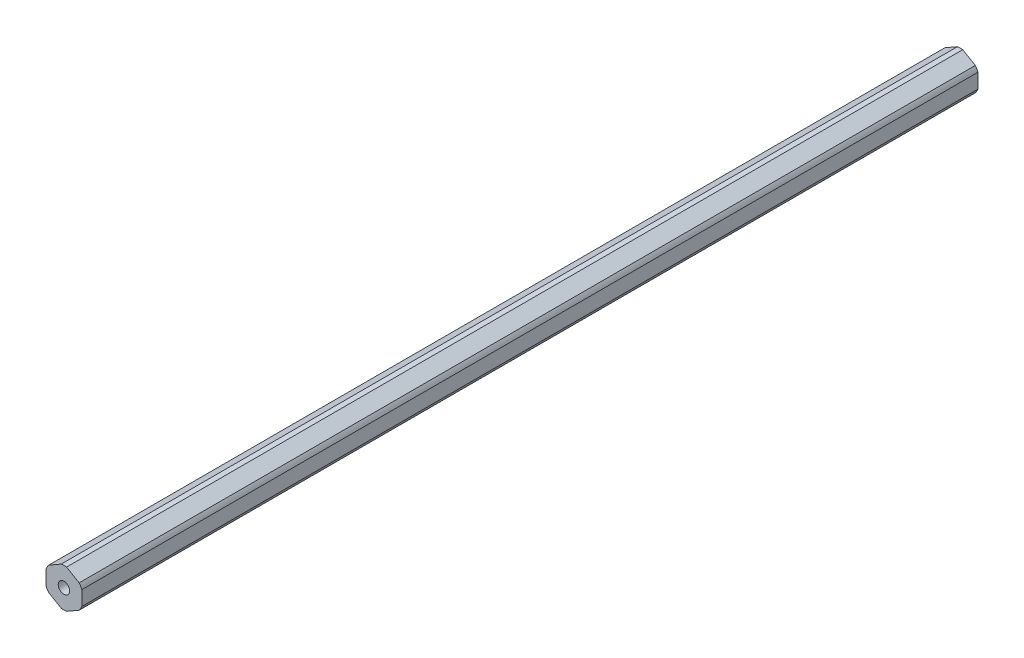
ISO-10303-21;
HEADER;
FILE_DESCRIPTION(('STEP AP214'),'2;1');
FILE_NAME('part.step','',(''),(''),'','','');
FILE_SCHEMA(('AUTOMOTIVE_DESIGN { 1 0 10303 214 1 1 1 1 }'));
ENDSEC;
DATA;
#1=APPLICATION_CONTEXT('core data for automotive mechanical design processes');
#2=APPLICATION_PROTOCOL_DEFINITION('international standard','automotive_design',2000,#1);
#3=PRODUCT_CONTEXT('',#1,'mechanical');
#4=PRODUCT('Part','Part','',(#3));
#5=PRODUCT_RELATED_PRODUCT_CATEGORY('part','',(#4));
#6=PRODUCT_DEFINITION_FORMATION('','',#4);
#7=PRODUCT_DEFINITION_CONTEXT('part definition',#1,'design');
#8=PRODUCT_DEFINITION('design','',#6,#7);
#9=PRODUCT_DEFINITION_SHAPE('','',#8);
#10=(LENGTH_UNIT() NAMED_UNIT(*) SI_UNIT(.MILLI.,.METRE.));
#11=(NAMED_UNIT(*) PLANE_ANGLE_UNIT() SI_UNIT($,.RADIAN.));
#12=(NAMED_UNIT(*) SI_UNIT($,.STERADIAN.) SOLID_ANGLE_UNIT());
#13=UNCERTAINTY_MEASURE_WITH_UNIT(LENGTH_MEASURE(1.E-05),#10,'distance_accuracy_value','');
#14=(GEOMETRIC_REPRESENTATION_CONTEXT(3) GLOBAL_UNCERTAINTY_ASSIGNED_CONTEXT((#13)) GLOBAL_UNIT_ASSIGNED_CONTEXT((#10,
#11,#12)) REPRESENTATION_CONTEXT('',''));
#15=CARTESIAN_POINT('',(0.,0.,0.));
#16=DIRECTION('',(0.,0.,1.));
#17=DIRECTION('',(1.,0.,0.));
#18=AXIS2_PLACEMENT_3D('',#15,#16,#17);
#19=CARTESIAN_POINT('',(6.35,0.,158.8516));
#20=DIRECTION('',(-1.,0.,0.));
#21=DIRECTION('',(0.,0.,1.));
#22=AXIS2_PLACEMENT_3D('',#19,#20,#21);
#23=PLANE('',#22);
#24=DIRECTION('',(0.,1.,0.));
#25=VECTOR('',#24,1.);
#26=CARTESIAN_POINT('',(6.35,0.,-158.8516));
#27=LINE('',#26,#25);
#28=CARTESIAN_POINT('',(6.35,-2.59030191290513,-158.8516));
#29=VERTEX_POINT('',#28);
#30=CARTESIAN_POINT('',(6.35,2.59030191290513,-158.8516));
#31=VERTEX_POINT('',#30);
#32=EDGE_CURVE('E187',#29,#31,#27,.T.);
#33=ORIENTED_EDGE('',*,*,#32,.T.);
#34=DIRECTION('',(0.,0.,-1.));
#35=VECTOR('',#34,1.);
#36=CARTESIAN_POINT('',(6.35,2.59030191290513,158.8516));
#37=LINE('',#36,#35);
#38=CARTESIAN_POINT('',(6.35,2.59030191290513,158.8516));
#39=VERTEX_POINT('',#38);
#40=EDGE_CURVE('E11',#39,#31,#37,.T.);
#41=ORIENTED_EDGE('',*,*,#40,.F.);
#42=DIRECTION('',(0.,1.,0.));
#43=VECTOR('',#42,1.);
#44=CARTESIAN_POINT('',(6.35,0.,158.8516));
#45=LINE('',#44,#43);
#46=CARTESIAN_POINT('',(6.35,-2.59030191290513,158.8516));
#47=VERTEX_POINT('',#46);
#48=EDGE_CURVE('E267',#47,#39,#45,.T.);
#49=ORIENTED_EDGE('',*,*,#48,.F.);
#50=DIRECTION('',(0.,0.,-1.));
#51=VECTOR('',#50,1.);
#52=CARTESIAN_POINT('',(6.35,-2.59030191290513,158.8516));
#53=LINE('',#52,#51);
#54=EDGE_CURVE('E183',#47,#29,#53,.T.);
#55=ORIENTED_EDGE('',*,*,#54,.T.);
#56=EDGE_LOOP('',(#33,#41,#49,#55));
#57=FACE_BOUND('',#56,.T.);
#58=ADVANCED_FACE('F58',(#57),#23,.F.);
#59=CARTESIAN_POINT('',(0.,0.,158.8516));
#60=DIRECTION('',(0.,0.,-1.));
#61=DIRECTION('',(-1.,0.,0.));
#62=AXIS2_PLACEMENT_3D('',#59,#60,#61);
#63=CYLINDRICAL_SURFACE('',#62,6.858);
#64=CARTESIAN_POINT('',(0.,0.,-158.8516));
#65=DIRECTION('',(0.,0.,1.));
#66=DIRECTION('',(1.,0.,0.));
#67=AXIS2_PLACEMENT_3D('',#64,#65,#66);
#68=CIRCLE('',#67,6.858);
#69=CARTESIAN_POINT('',(5.41826726004727,4.20411035757862,-158.8516));
#70=VERTEX_POINT('',#69);
#71=EDGE_CURVE('E191',#31,#70,#68,.T.);
#72=ORIENTED_EDGE('',*,*,#71,.T.);
#73=DIRECTION('',(0.,0.,-1.));
#74=VECTOR('',#73,1.);
#75=CARTESIAN_POINT('',(5.41826726004727,4.20411035757862,158.8516));
#76=LINE('',#75,#74);
#77=CARTESIAN_POINT('',(5.41826726004727,4.20411035757862,158.8516));
#78=VERTEX_POINT('',#77);
#79=EDGE_CURVE('E67',#78,#70,#76,.T.);
#80=ORIENTED_EDGE('',*,*,#79,.F.);
#81=CARTESIAN_POINT('',(0.,0.,158.8516));
#82=DIRECTION('',(0.,0.,1.));
#83=DIRECTION('',(1.,0.,0.));
#84=AXIS2_PLACEMENT_3D('',#81,#82,#83);
#85=CIRCLE('',#84,6.858);
#86=EDGE_CURVE('E131',#39,#78,#85,.T.);
#87=ORIENTED_EDGE('',*,*,#86,.F.);
#88=ORIENTED_EDGE('',*,*,#40,.T.);
#89=EDGE_LOOP('',(#72,#80,#87,#88));
#90=FACE_BOUND('',#89,.T.);
#91=ADVANCED_FACE('F310',(#90),#63,.T.);
#92=CARTESIAN_POINT('',(3.175,5.49926131403119,158.8516));
#93=DIRECTION('',(-0.5,-0.866025403784439,0.));
#94=DIRECTION('',(0.866025403784439,-0.5,0.));
#95=AXIS2_PLACEMENT_3D('',#92,#93,#94);
#96=PLANE('',#95);
#97=DIRECTION('',(-0.866025403784439,0.5,0.));
#98=VECTOR('',#97,1.);
#99=CARTESIAN_POINT('',(3.175,5.49926131403119,-158.8516));
#100=LINE('',#99,#98);
#101=CARTESIAN_POINT('',(0.931732739952729,6.79441227048375,-158.8516));
#102=VERTEX_POINT('',#101);
#103=EDGE_CURVE('E195',#70,#102,#100,.T.);
#104=ORIENTED_EDGE('',*,*,#103,.T.);
#105=DIRECTION('',(0.,0.,-1.));
#106=VECTOR('',#105,1.);
#107=CARTESIAN_POINT('',(0.931732739952729,6.79441227048375,158.8516));
#108=LINE('',#107,#106);
#109=CARTESIAN_POINT('',(0.931732739952729,6.79441227048375,158.8516));
#110=VERTEX_POINT('',#109);
#111=EDGE_CURVE('E238',#110,#102,#108,.T.);
#112=ORIENTED_EDGE('',*,*,#111,.F.);
#113=DIRECTION('',(-0.866025403784439,0.5,0.));
#114=VECTOR('',#113,1.);
#115=CARTESIAN_POINT('',(3.175,5.49926131403119,158.8516));
#116=LINE('',#115,#114);
#117=EDGE_CURVE('E248',#78,#110,#116,.T.);
#118=ORIENTED_EDGE('',*,*,#117,.F.);
#119=ORIENTED_EDGE('',*,*,#79,.T.);
#120=EDGE_LOOP('',(#104,#112,#118,#119));
#121=FACE_BOUND('',#120,.T.);
#122=ADVANCED_FACE('F246',(#121),#96,.F.);
#123=CARTESIAN_POINT('',(-0.931732739952725,6.79441227048375,-158.8516));
#124=VERTEX_POINT('',#123);
#125=EDGE_CURVE('E196',#102,#124,#68,.T.);
#126=ORIENTED_EDGE('',*,*,#125,.T.);
#127=DIRECTION('',(0.,0.,-1.));
#128=VECTOR('',#127,1.);
#129=CARTESIAN_POINT('',(-0.931732739952725,6.79441227048375,158.8516));
#130=LINE('',#129,#128);
#131=CARTESIAN_POINT('',(-0.931732739952725,6.79441227048375,158.8516));
#132=VERTEX_POINT('',#131);
#133=EDGE_CURVE('E234',#132,#124,#130,.T.);
#134=ORIENTED_EDGE('',*,*,#133,.F.);
#135=EDGE_CURVE('E273',#110,#132,#85,.T.);
#136=ORIENTED_EDGE('',*,*,#135,.F.);
#137=ORIENTED_EDGE('',*,*,#111,.T.);
#138=EDGE_LOOP('',(#126,#134,#136,#137));
#139=FACE_BOUND('',#138,.T.);
#140=ADVANCED_FACE('F293',(#139),#63,.T.);
#141=CARTESIAN_POINT('',(-3.175,5.49926131403118,158.8516));
#142=DIRECTION('',(0.5,-0.866025403784439,0.));
#143=DIRECTION('',(0.866025403784439,0.5,0.));
#144=AXIS2_PLACEMENT_3D('',#141,#142,#143);
#145=PLANE('',#144);
#146=DIRECTION('',(-0.866025403784439,-0.5,0.));
#147=VECTOR('',#146,1.);
#148=CARTESIAN_POINT('',(-3.175,5.49926131403118,-158.8516));
#149=LINE('',#148,#147);
#150=CARTESIAN_POINT('',(-5.41826726004727,4.20411035757862,-158.8516));
#151=VERTEX_POINT('',#150);
#152=EDGE_CURVE('E199',#124,#151,#149,.T.);
#153=ORIENTED_EDGE('',*,*,#152,.T.);
#154=DIRECTION('',(0.,0.,-1.));
#155=VECTOR('',#154,1.);
#156=CARTESIAN_POINT('',(-5.41826726004727,4.20411035757862,158.8516));
#157=LINE('',#156,#155);
#158=CARTESIAN_POINT('',(-5.41826726004727,4.20411035757862,158.8516));
#159=VERTEX_POINT('',#158);
#160=EDGE_CURVE('E230',#159,#151,#157,.T.);
#161=ORIENTED_EDGE('',*,*,#160,.F.);
#162=DIRECTION('',(-0.866025403784439,-0.5,0.));
#163=VECTOR('',#162,1.);
#164=CARTESIAN_POINT('',(-3.175,5.49926131403118,158.8516));
#165=LINE('',#164,#163);
#166=EDGE_CURVE('E279',#132,#159,#165,.T.);
#167=ORIENTED_EDGE('',*,*,#166,.F.);
#168=ORIENTED_EDGE('',*,*,#133,.T.);
#169=EDGE_LOOP('',(#153,#161,#167,#168));
#170=FACE_BOUND('',#169,.T.);
#171=ADVANCED_FACE('F295',(#170),#145,.F.);
#172=CARTESIAN_POINT('',(-6.35,2.59030191290514,-158.8516));
#173=VERTEX_POINT('',#172);
#174=EDGE_CURVE('E202',#151,#173,#68,.T.);
#175=ORIENTED_EDGE('',*,*,#174,.T.);
#176=DIRECTION('',(0.,0.,-1.));
#177=VECTOR('',#176,1.);
#178=CARTESIAN_POINT('',(-6.35,2.59030191290514,158.8516));
#179=LINE('',#178,#177);
#180=CARTESIAN_POINT('',(-6.35,2.59030191290514,158.8516));
#181=VERTEX_POINT('',#180);
#182=EDGE_CURVE('E226',#181,#173,#179,.T.);
#183=ORIENTED_EDGE('',*,*,#182,.F.);
#184=EDGE_CURVE('E281',#159,#181,#85,.T.);
#185=ORIENTED_EDGE('',*,*,#184,.F.);
#186=ORIENTED_EDGE('',*,*,#160,.T.);
#187=EDGE_LOOP('',(#175,#183,#185,#186));
#188=FACE_BOUND('',#187,.T.);
#189=ADVANCED_FACE('F296',(#188),#63,.T.);
#190=CARTESIAN_POINT('',(-6.35,0.,158.8516));
#191=DIRECTION('',(1.,0.,0.));
#192=DIRECTION('',(0.,0.,-1.));
#193=AXIS2_PLACEMENT_3D('',#190,#191,#192);
#194=PLANE('',#193);
#195=DIRECTION('',(0.,-1.,0.));
#196=VECTOR('',#195,1.);
#197=CARTESIAN_POINT('',(-6.35,0.,-158.8516));
#198=LINE('',#197,#196);
#199=CARTESIAN_POINT('',(-6.35,-2.59030191290514,-158.8516));
#200=VERTEX_POINT('',#199);
#201=EDGE_CURVE('E203',#173,#200,#198,.T.);
#202=ORIENTED_EDGE('',*,*,#201,.T.);
#203=DIRECTION('',(0.,0.,-1.));
#204=VECTOR('',#203,1.);
#205=CARTESIAN_POINT('',(-6.35,-2.59030191290514,158.8516));
#206=LINE('',#205,#204);
#207=CARTESIAN_POINT('',(-6.35,-2.59030191290514,158.8516));
#208=VERTEX_POINT('',#207);
#209=EDGE_CURVE('E222',#208,#200,#206,.T.);
#210=ORIENTED_EDGE('',*,*,#209,.F.);
#211=DIRECTION('',(0.,-1.,0.));
#212=VECTOR('',#211,1.);
#213=CARTESIAN_POINT('',(-6.35,0.,158.8516));
#214=LINE('',#213,#212);
#215=EDGE_CURVE('E282',#181,#208,#214,.T.);
#216=ORIENTED_EDGE('',*,*,#215,.F.);
#217=ORIENTED_EDGE('',*,*,#182,.T.);
#218=EDGE_LOOP('',(#202,#210,#216,#217));
#219=FACE_BOUND('',#218,.T.);
#220=ADVANCED_FACE('F299',(#219),#194,.F.);
#221=CARTESIAN_POINT('',(-5.41826726004728,-4.20411035757862,-158.8516));
#222=VERTEX_POINT('',#221);
#223=EDGE_CURVE('E206',#200,#222,#68,.T.);
#224=ORIENTED_EDGE('',*,*,#223,.T.);
#225=DIRECTION('',(0.,0.,-1.));
#226=VECTOR('',#225,1.);
#227=CARTESIAN_POINT('',(-5.41826726004728,-4.20411035757862,158.8516));
#228=LINE('',#227,#226);
#229=CARTESIAN_POINT('',(-5.41826726004728,-4.20411035757862,158.8516));
#230=VERTEX_POINT('',#229);
#231=EDGE_CURVE('E218',#230,#222,#228,.T.);
#232=ORIENTED_EDGE('',*,*,#231,.F.);
#233=EDGE_CURVE('E170',#208,#230,#85,.T.);
#234=ORIENTED_EDGE('',*,*,#233,.F.);
#235=ORIENTED_EDGE('',*,*,#209,.T.);
#236=EDGE_LOOP('',(#224,#232,#234,#235));
#237=FACE_BOUND('',#236,.T.);
#238=ADVANCED_FACE('F301',(#237),#63,.T.);
#239=CARTESIAN_POINT('',(-3.175,-5.49926131403118,158.8516));
#240=DIRECTION('',(0.5,0.866025403784439,0.));
#241=DIRECTION('',(-0.866025403784439,0.5,0.));
#242=AXIS2_PLACEMENT_3D('',#239,#240,#241);
#243=PLANE('',#242);
#244=DIRECTION('',(0.866025403784439,-0.5,0.));
#245=VECTOR('',#244,1.);
#246=CARTESIAN_POINT('',(-3.175,-5.49926131403118,-158.8516));
#247=LINE('',#246,#245);
#248=CARTESIAN_POINT('',(-0.931732739952722,-6.79441227048375,-158.8516));
#249=VERTEX_POINT('',#248);
#250=EDGE_CURVE('E207',#222,#249,#247,.T.);
#251=ORIENTED_EDGE('',*,*,#250,.T.);
#252=DIRECTION('',(0.,0.,-1.));
#253=VECTOR('',#252,1.);
#254=CARTESIAN_POINT('',(-0.931732739952722,-6.79441227048375,158.8516));
#255=LINE('',#254,#253);
#256=CARTESIAN_POINT('',(-0.931732739952722,-6.79441227048375,158.8516));
#257=VERTEX_POINT('',#256);
#258=EDGE_CURVE('E176',#257,#249,#255,.T.);
#259=ORIENTED_EDGE('',*,*,#258,.F.);
#260=DIRECTION('',(0.866025403784439,-0.5,0.));
#261=VECTOR('',#260,1.);
#262=CARTESIAN_POINT('',(-3.175,-5.49926131403118,158.8516));
#263=LINE('',#262,#261);
#264=EDGE_CURVE('E164',#230,#257,#263,.T.);
#265=ORIENTED_EDGE('',*,*,#264,.F.);
#266=ORIENTED_EDGE('',*,*,#231,.T.);
#267=EDGE_LOOP('',(#251,#259,#265,#266));
#268=FACE_BOUND('',#267,.T.);
#269=ADVANCED_FACE('F304',(#268),#243,.F.);
#270=CARTESIAN_POINT('',(0.93173273995273,-6.79441227048375,-158.8516));
#271=VERTEX_POINT('',#270);
#272=EDGE_CURVE('E174',#249,#271,#68,.T.);
#273=ORIENTED_EDGE('',*,*,#272,.T.);
#274=DIRECTION('',(0.,0.,-1.));
#275=VECTOR('',#274,1.);
#276=CARTESIAN_POINT('',(0.93173273995273,-6.79441227048375,158.8516));
#277=LINE('',#276,#275);
#278=CARTESIAN_POINT('',(0.93173273995273,-6.79441227048375,158.8516));
#279=VERTEX_POINT('',#278);
#280=EDGE_CURVE('E171',#279,#271,#277,.T.);
#281=ORIENTED_EDGE('',*,*,#280,.F.);
#282=EDGE_CURVE('E158',#257,#279,#85,.T.);
#283=ORIENTED_EDGE('',*,*,#282,.F.);
#284=ORIENTED_EDGE('',*,*,#258,.T.);
#285=EDGE_LOOP('',(#273,#281,#283,#284));
#286=FACE_BOUND('',#285,.T.);
#287=ADVANCED_FACE('F172',(#286),#63,.T.);
#288=CARTESIAN_POINT('',(3.175,-5.49926131403119,158.8516));
#289=DIRECTION('',(-0.5,0.866025403784439,0.));
#290=DIRECTION('',(-0.866025403784439,-0.5,0.));
#291=AXIS2_PLACEMENT_3D('',#288,#289,#290);
#292=PLANE('',#291);
#293=DIRECTION('',(0.866025403784439,0.5,0.));
#294=VECTOR('',#293,1.);
#295=CARTESIAN_POINT('',(3.175,-5.49926131403119,-158.8516));
#296=LINE('',#295,#294);
#297=CARTESIAN_POINT('',(5.41826726004727,-4.20411035757862,-158.8516));
#298=VERTEX_POINT('',#297);
#299=EDGE_CURVE('E117',#271,#298,#296,.T.);
#300=ORIENTED_EDGE('',*,*,#299,.T.);
#301=DIRECTION('',(0.,0.,-1.));
#302=VECTOR('',#301,1.);
#303=CARTESIAN_POINT('',(5.41826726004727,-4.20411035757862,158.8516));
#304=LINE('',#303,#302);
#305=CARTESIAN_POINT('',(5.41826726004727,-4.20411035757862,158.8516));
#306=VERTEX_POINT('',#305);
#307=EDGE_CURVE('E177',#306,#298,#304,.T.);
#308=ORIENTED_EDGE('',*,*,#307,.F.);
#309=DIRECTION('',(0.866025403784439,0.5,0.));
#310=VECTOR('',#309,1.);
#311=CARTESIAN_POINT('',(3.175,-5.49926131403119,158.8516));
#312=LINE('',#311,#310);
#313=EDGE_CURVE('E162',#279,#306,#312,.T.);
#314=ORIENTED_EDGE('',*,*,#313,.F.);
#315=ORIENTED_EDGE('',*,*,#280,.T.);
#316=EDGE_LOOP('',(#300,#308,#314,#315));
#317=FACE_BOUND('',#316,.T.);
#318=ADVANCED_FACE('F179',(#317),#292,.F.);
#319=EDGE_CURVE('E123',#298,#29,#68,.T.);
#320=ORIENTED_EDGE('',*,*,#319,.T.);
#321=ORIENTED_EDGE('',*,*,#54,.F.);
#322=EDGE_CURVE('E75',#306,#47,#85,.T.);
#323=ORIENTED_EDGE('',*,*,#322,.F.);
#324=ORIENTED_EDGE('',*,*,#307,.T.);
#325=EDGE_LOOP('',(#320,#321,#323,#324));
#326=FACE_BOUND('',#325,.T.);
#327=ADVANCED_FACE('F307',(#326),#63,.T.);
#328=CARTESIAN_POINT('',(0.,0.,158.8516));
#329=DIRECTION('',(0.,0.,1.));
#330=DIRECTION('',(1.,0.,0.));
#331=AXIS2_PLACEMENT_3D('',#328,#329,#330);
#332=PLANE('',#331);
#333=CARTESIAN_POINT('',(0.,0.,158.8516));
#334=DIRECTION('',(0.,0.,1.));
#335=DIRECTION('',(1.,0.,0.));
#336=AXIS2_PLACEMENT_3D('',#333,#334,#335);
#337=CIRCLE('',#336,2.01929999999999);
#338=CARTESIAN_POINT('',(2.01929999999999,0.,158.8516));
#339=VERTEX_POINT('',#338);
#340=EDGE_CURVE('E480',#339,#339,#337,.T.);
#341=ORIENTED_EDGE('',*,*,#340,.F.);
#342=EDGE_LOOP('',(#341));
#343=FACE_BOUND('',#342,.T.);
#344=ORIENTED_EDGE('',*,*,#48,.T.);
#345=ORIENTED_EDGE('',*,*,#86,.T.);
#346=ORIENTED_EDGE('',*,*,#117,.T.);
#347=ORIENTED_EDGE('',*,*,#135,.T.);
#348=ORIENTED_EDGE('',*,*,#166,.T.);
#349=ORIENTED_EDGE('',*,*,#184,.T.);
#350=ORIENTED_EDGE('',*,*,#215,.T.);
#351=ORIENTED_EDGE('',*,*,#233,.T.);
#352=ORIENTED_EDGE('',*,*,#264,.T.);
#353=ORIENTED_EDGE('',*,*,#282,.T.);
#354=ORIENTED_EDGE('',*,*,#313,.T.);
#355=ORIENTED_EDGE('',*,*,#322,.T.);
#356=EDGE_LOOP('',(#344,#345,#346,#347,#348,#349,#350,#351,#352,#353,#354,#355));
#357=FACE_BOUND('',#356,.T.);
#358=ADVANCED_FACE('F160',(#343,#357),#332,.T.);
#359=CARTESIAN_POINT('',(0.,0.,-158.8516));
#360=DIRECTION('',(0.,0.,1.));
#361=DIRECTION('',(1.,0.,0.));
#362=AXIS2_PLACEMENT_3D('',#359,#360,#361);
#363=PLANE('',#362);
#364=CARTESIAN_POINT('',(0.,0.,-158.8516));
#365=DIRECTION('',(0.,0.,-1.));
#366=DIRECTION('',(-1.,0.,0.));
#367=AXIS2_PLACEMENT_3D('',#364,#365,#366);
#368=CIRCLE('',#367,2.01929999999999);
#369=CARTESIAN_POINT('',(-2.01929999999999,0.,-158.8516));
#370=VERTEX_POINT('',#369);
#371=EDGE_CURVE('E476',#370,#370,#368,.T.);
#372=ORIENTED_EDGE('',*,*,#371,.F.);
#373=EDGE_LOOP('',(#372));
#374=FACE_BOUND('',#373,.T.);
#375=ORIENTED_EDGE('',*,*,#32,.F.);
#376=ORIENTED_EDGE('',*,*,#319,.F.);
#377=ORIENTED_EDGE('',*,*,#299,.F.);
#378=ORIENTED_EDGE('',*,*,#272,.F.);
#379=ORIENTED_EDGE('',*,*,#250,.F.);
#380=ORIENTED_EDGE('',*,*,#223,.F.);
#381=ORIENTED_EDGE('',*,*,#201,.F.);
#382=ORIENTED_EDGE('',*,*,#174,.F.);
#383=ORIENTED_EDGE('',*,*,#152,.F.);
#384=ORIENTED_EDGE('',*,*,#125,.F.);
#385=ORIENTED_EDGE('',*,*,#103,.F.);
#386=ORIENTED_EDGE('',*,*,#71,.F.);
#387=EDGE_LOOP('',(#375,#376,#377,#378,#379,#380,#381,#382,#383,#384,#385,#386));
#388=FACE_BOUND('',#387,.T.);
#389=ADVANCED_FACE('F252',(#374,#388),#363,.F.);
#390=CARTESIAN_POINT('',(0.,0.,146.82216));
#391=DIRECTION('',(0.,0.,1.));
#392=DIRECTION('',(1.,0.,0.));
#393=AXIS2_PLACEMENT_3D('',#390,#391,#392);
#394=CONICAL_SURFACE('',#393,2.01929999999999,1.02974425867665);
#395=CARTESIAN_POINT('',(0.,0.,145.608842151998));
#396=VERTEX_POINT('',#395);
#397=VERTEX_LOOP('',#396);
#398=FACE_BOUND('',#397,.T.);
#399=CARTESIAN_POINT('',(0.,0.,146.82216));
#400=DIRECTION('',(0.,0.,1.));
#401=DIRECTION('',(1.,0.,0.));
#402=AXIS2_PLACEMENT_3D('',#399,#400,#401);
#403=CIRCLE('',#402,2.01929999999999);
#404=CARTESIAN_POINT('',(2.01929999999999,0.,146.82216));
#405=VERTEX_POINT('',#404);
#406=EDGE_CURVE('E192',#405,#405,#403,.T.);
#407=ORIENTED_EDGE('',*,*,#406,.T.);
#408=EDGE_LOOP('',(#407));
#409=FACE_BOUND('',#408,.T.);
#410=ADVANCED_FACE('F406',(#398,#409),#394,.F.);
#411=CARTESIAN_POINT('',(0.,0.,158.8516));
#412=DIRECTION('',(0.,0.,1.));
#413=DIRECTION('',(1.,0.,0.));
#414=AXIS2_PLACEMENT_3D('',#411,#412,#413);
#415=CYLINDRICAL_SURFACE('',#414,2.01929999999999);
#416=ORIENTED_EDGE('',*,*,#406,.F.);
#417=EDGE_LOOP('',(#416));
#418=FACE_BOUND('',#417,.T.);
#419=ORIENTED_EDGE('',*,*,#340,.T.);
#420=EDGE_LOOP('',(#419));
#421=FACE_BOUND('',#420,.T.);
#422=ADVANCED_FACE('F415',(#418,#421),#415,.F.);
#423=CARTESIAN_POINT('',(0.,0.,-146.82216));
#424=DIRECTION('',(0.,0.,-1.));
#425=DIRECTION('',(-1.,0.,0.));
#426=AXIS2_PLACEMENT_3D('',#423,#424,#425);
#427=CONICAL_SURFACE('',#426,2.01929999999999,1.02974425867665);
#428=CARTESIAN_POINT('',(0.,0.,-145.608842151998));
#429=VERTEX_POINT('',#428);
#430=VERTEX_LOOP('',#429);
#431=FACE_BOUND('',#430,.T.);
#432=CARTESIAN_POINT('',(0.,0.,-146.82216));
#433=DIRECTION('',(0.,0.,-1.));
#434=DIRECTION('',(-1.,0.,0.));
#435=AXIS2_PLACEMENT_3D('',#432,#433,#434);
#436=CIRCLE('',#435,2.01929999999999);
#437=CARTESIAN_POINT('',(-2.01929999999999,0.,-146.82216));
#438=VERTEX_POINT('',#437);
#439=EDGE_CURVE('E473',#438,#438,#436,.T.);
#440=ORIENTED_EDGE('',*,*,#439,.T.);
#441=EDGE_LOOP('',(#440));
#442=FACE_BOUND('',#441,.T.);
#443=ADVANCED_FACE('F426',(#431,#442),#427,.F.);
#444=CARTESIAN_POINT('',(0.,0.,-158.8516));
#445=DIRECTION('',(0.,0.,-1.));
#446=DIRECTION('',(-1.,0.,0.));
#447=AXIS2_PLACEMENT_3D('',#444,#445,#446);
#448=CYLINDRICAL_SURFACE('',#447,2.01929999999999);
#449=ORIENTED_EDGE('',*,*,#439,.F.);
#450=EDGE_LOOP('',(#449));
#451=FACE_BOUND('',#450,.T.);
#452=ORIENTED_EDGE('',*,*,#371,.T.);
#453=EDGE_LOOP('',(#452));
#454=FACE_BOUND('',#453,.T.);
#455=ADVANCED_FACE('F437',(#451,#454),#448,.F.);
#456=CLOSED_SHELL('',(#58,#91,#122,#140,#171,#189,#220,#238,#269,#287,#318,#327,#358,#389,#410,
#422,#443,#455));
#457=MANIFOLD_SOLID_BREP('B2',#456);
#458=ADVANCED_BREP_SHAPE_REPRESENTATION('',(#18,#457),#14);
#459=SHAPE_DEFINITION_REPRESENTATION(#9,#458);
ENDSEC;
END-ISO-10303-21;
